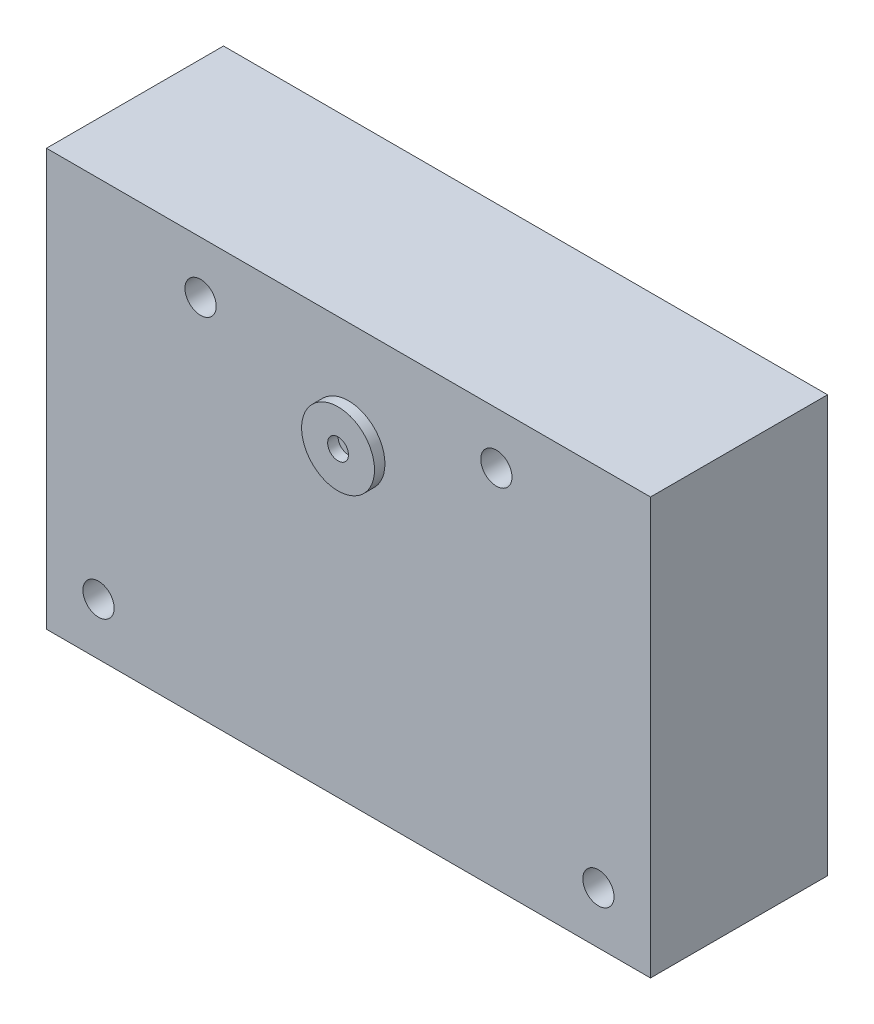
ISO-10303-21;
HEADER;
FILE_DESCRIPTION(('STEP AP214'),'2;1');
FILE_NAME('part.step','',(''),(''),'','','');
FILE_SCHEMA(('AUTOMOTIVE_DESIGN { 1 0 10303 214 1 1 1 1 }'));
ENDSEC;
DATA;
#1=APPLICATION_CONTEXT('core data for automotive mechanical design processes');
#2=APPLICATION_PROTOCOL_DEFINITION('international standard','automotive_design',2000,#1);
#3=PRODUCT_CONTEXT('',#1,'mechanical');
#4=PRODUCT('Part','Part','',(#3));
#5=PRODUCT_RELATED_PRODUCT_CATEGORY('part','',(#4));
#6=PRODUCT_DEFINITION_FORMATION('','',#4);
#7=PRODUCT_DEFINITION_CONTEXT('part definition',#1,'design');
#8=PRODUCT_DEFINITION('design','',#6,#7);
#9=PRODUCT_DEFINITION_SHAPE('','',#8);
#10=(LENGTH_UNIT() NAMED_UNIT(*) SI_UNIT(.MILLI.,.METRE.));
#11=(NAMED_UNIT(*) PLANE_ANGLE_UNIT() SI_UNIT($,.RADIAN.));
#12=(NAMED_UNIT(*) SI_UNIT($,.STERADIAN.) SOLID_ANGLE_UNIT());
#13=UNCERTAINTY_MEASURE_WITH_UNIT(LENGTH_MEASURE(1.E-05),#10,'distance_accuracy_value','');
#14=(GEOMETRIC_REPRESENTATION_CONTEXT(3) GLOBAL_UNCERTAINTY_ASSIGNED_CONTEXT((#13)) GLOBAL_UNIT_ASSIGNED_CONTEXT((#10,
#11,#12)) REPRESENTATION_CONTEXT('',''));
#15=CARTESIAN_POINT('',(0.,0.,0.));
#16=DIRECTION('',(0.,0.,1.));
#17=DIRECTION('',(1.,0.,0.));
#18=AXIS2_PLACEMENT_3D('',#15,#16,#17);
#19=CARTESIAN_POINT('',(29.,20.,17.));
#20=DIRECTION('',(-1.,0.,0.));
#21=DIRECTION('',(0.,-1.,0.));
#22=AXIS2_PLACEMENT_3D('',#19,#20,#21);
#23=PLANE('',#22);
#24=DIRECTION('',(0.,1.,0.));
#25=VECTOR('',#24,1.);
#26=CARTESIAN_POINT('',(29.,20.,0.));
#27=LINE('',#26,#25);
#28=CARTESIAN_POINT('',(29.,-20.,0.));
#29=VERTEX_POINT('',#28);
#30=CARTESIAN_POINT('',(29.,20.,0.));
#31=VERTEX_POINT('',#30);
#32=EDGE_CURVE('E173',#29,#31,#27,.T.);
#33=ORIENTED_EDGE('',*,*,#32,.T.);
#34=DIRECTION('',(0.,0.,-1.));
#35=VECTOR('',#34,1.);
#36=CARTESIAN_POINT('',(29.,20.,17.));
#37=LINE('',#36,#35);
#38=CARTESIAN_POINT('',(29.,20.,17.));
#39=VERTEX_POINT('',#38);
#40=EDGE_CURVE('E47',#39,#31,#37,.T.);
#41=ORIENTED_EDGE('',*,*,#40,.F.);
#42=DIRECTION('',(0.,1.,0.));
#43=VECTOR('',#42,1.);
#44=CARTESIAN_POINT('',(29.,20.,17.));
#45=LINE('',#44,#43);
#46=CARTESIAN_POINT('',(29.,-20.,17.));
#47=VERTEX_POINT('',#46);
#48=EDGE_CURVE('E201',#47,#39,#45,.T.);
#49=ORIENTED_EDGE('',*,*,#48,.F.);
#50=DIRECTION('',(0.,0.,-1.));
#51=VECTOR('',#50,1.);
#52=CARTESIAN_POINT('',(29.,-20.,17.));
#53=LINE('',#52,#51);
#54=EDGE_CURVE('E211',#47,#29,#53,.T.);
#55=ORIENTED_EDGE('',*,*,#54,.T.);
#56=EDGE_LOOP('',(#33,#41,#49,#55));
#57=FACE_BOUND('',#56,.T.);
#58=ADVANCED_FACE('F39',(#57),#23,.F.);
#59=CARTESIAN_POINT('',(-29.,20.,17.));
#60=DIRECTION('',(0.,-1.,0.));
#61=DIRECTION('',(0.,0.,-1.));
#62=AXIS2_PLACEMENT_3D('',#59,#60,#61);
#63=PLANE('',#62);
#64=DIRECTION('',(-1.,0.,0.));
#65=VECTOR('',#64,1.);
#66=CARTESIAN_POINT('',(-29.,20.,0.));
#67=LINE('',#66,#65);
#68=CARTESIAN_POINT('',(-29.,20.,0.));
#69=VERTEX_POINT('',#68);
#70=EDGE_CURVE('E215',#31,#69,#67,.T.);
#71=ORIENTED_EDGE('',*,*,#70,.T.);
#72=DIRECTION('',(0.,0.,-1.));
#73=VECTOR('',#72,1.);
#74=CARTESIAN_POINT('',(-29.,20.,17.));
#75=LINE('',#74,#73);
#76=CARTESIAN_POINT('',(-29.,20.,17.));
#77=VERTEX_POINT('',#76);
#78=EDGE_CURVE('E228',#77,#69,#75,.T.);
#79=ORIENTED_EDGE('',*,*,#78,.F.);
#80=DIRECTION('',(-1.,0.,0.));
#81=VECTOR('',#80,1.);
#82=CARTESIAN_POINT('',(-29.,20.,17.));
#83=LINE('',#82,#81);
#84=EDGE_CURVE('E92',#39,#77,#83,.T.);
#85=ORIENTED_EDGE('',*,*,#84,.F.);
#86=ORIENTED_EDGE('',*,*,#40,.T.);
#87=EDGE_LOOP('',(#71,#79,#85,#86));
#88=FACE_BOUND('',#87,.T.);
#89=ADVANCED_FACE('F233',(#88),#63,.F.);
#90=CARTESIAN_POINT('',(-29.,20.,17.));
#91=DIRECTION('',(1.,0.,0.));
#92=DIRECTION('',(0.,1.,0.));
#93=AXIS2_PLACEMENT_3D('',#90,#91,#92);
#94=PLANE('',#93);
#95=DIRECTION('',(0.,-1.,0.));
#96=VECTOR('',#95,1.);
#97=CARTESIAN_POINT('',(-29.,20.,0.));
#98=LINE('',#97,#96);
#99=CARTESIAN_POINT('',(-29.,-20.,0.));
#100=VERTEX_POINT('',#99);
#101=EDGE_CURVE('E218',#69,#100,#98,.T.);
#102=ORIENTED_EDGE('',*,*,#101,.T.);
#103=DIRECTION('',(0.,0.,-1.));
#104=VECTOR('',#103,1.);
#105=CARTESIAN_POINT('',(-29.,-20.,17.));
#106=LINE('',#105,#104);
#107=CARTESIAN_POINT('',(-29.,-20.,17.));
#108=VERTEX_POINT('',#107);
#109=EDGE_CURVE('E225',#108,#100,#106,.T.);
#110=ORIENTED_EDGE('',*,*,#109,.F.);
#111=DIRECTION('',(0.,-1.,0.));
#112=VECTOR('',#111,1.);
#113=CARTESIAN_POINT('',(-29.,20.,17.));
#114=LINE('',#113,#112);
#115=EDGE_CURVE('E206',#77,#108,#114,.T.);
#116=ORIENTED_EDGE('',*,*,#115,.F.);
#117=ORIENTED_EDGE('',*,*,#78,.T.);
#118=EDGE_LOOP('',(#102,#110,#116,#117));
#119=FACE_BOUND('',#118,.T.);
#120=ADVANCED_FACE('F242',(#119),#94,.F.);
#121=CARTESIAN_POINT('',(-29.,-20.,17.));
#122=DIRECTION('',(0.,1.,0.));
#123=DIRECTION('',(0.,0.,1.));
#124=AXIS2_PLACEMENT_3D('',#121,#122,#123);
#125=PLANE('',#124);
#126=DIRECTION('',(1.,0.,0.));
#127=VECTOR('',#126,1.);
#128=CARTESIAN_POINT('',(-29.,-20.,0.));
#129=LINE('',#128,#127);
#130=EDGE_CURVE('E84',#100,#29,#129,.T.);
#131=ORIENTED_EDGE('',*,*,#130,.T.);
#132=ORIENTED_EDGE('',*,*,#54,.F.);
#133=DIRECTION('',(1.,0.,0.));
#134=VECTOR('',#133,1.);
#135=CARTESIAN_POINT('',(-29.,-20.,17.));
#136=LINE('',#135,#134);
#137=EDGE_CURVE('E63',#108,#47,#136,.T.);
#138=ORIENTED_EDGE('',*,*,#137,.F.);
#139=ORIENTED_EDGE('',*,*,#109,.T.);
#140=EDGE_LOOP('',(#131,#132,#138,#139));
#141=FACE_BOUND('',#140,.T.);
#142=ADVANCED_FACE('F244',(#141),#125,.F.);
#143=CARTESIAN_POINT('',(0.,0.,17.));
#144=DIRECTION('',(0.,0.,1.));
#145=DIRECTION('',(1.,0.,0.));
#146=AXIS2_PLACEMENT_3D('',#143,#144,#145);
#147=PLANE('',#146);
#148=CARTESIAN_POINT('',(0.,10.,17.));
#149=DIRECTION('',(0.,0.,1.));
#150=DIRECTION('',(1.,0.,0.));
#151=AXIS2_PLACEMENT_3D('',#148,#149,#150);
#152=CIRCLE('',#151,3.5);
#153=CARTESIAN_POINT('',(3.5,10.,17.));
#154=VERTEX_POINT('',#153);
#155=EDGE_CURVE('E144',#154,#154,#152,.T.);
#156=ORIENTED_EDGE('',*,*,#155,.F.);
#157=EDGE_LOOP('',(#156));
#158=FACE_BOUND('',#157,.T.);
#159=CARTESIAN_POINT('',(-24.,-15.,17.));
#160=DIRECTION('',(0.,0.,1.));
#161=DIRECTION('',(1.,0.,0.));
#162=AXIS2_PLACEMENT_3D('',#159,#160,#161);
#163=CIRCLE('',#162,1.5);
#164=CARTESIAN_POINT('',(-22.5,-15.,17.));
#165=VERTEX_POINT('',#164);
#166=EDGE_CURVE('E174',#165,#165,#163,.T.);
#167=ORIENTED_EDGE('',*,*,#166,.F.);
#168=EDGE_LOOP('',(#167));
#169=FACE_BOUND('',#168,.T.);
#170=CARTESIAN_POINT('',(14.2,15.,17.));
#171=DIRECTION('',(0.,0.,1.));
#172=DIRECTION('',(1.,0.,0.));
#173=AXIS2_PLACEMENT_3D('',#170,#171,#172);
#174=CIRCLE('',#173,1.5);
#175=CARTESIAN_POINT('',(15.7,15.,17.));
#176=VERTEX_POINT('',#175);
#177=EDGE_CURVE('E163',#176,#176,#174,.T.);
#178=ORIENTED_EDGE('',*,*,#177,.F.);
#179=EDGE_LOOP('',(#178));
#180=FACE_BOUND('',#179,.T.);
#181=CARTESIAN_POINT('',(-14.2,15.,17.));
#182=DIRECTION('',(0.,0.,1.));
#183=DIRECTION('',(1.,0.,0.));
#184=AXIS2_PLACEMENT_3D('',#181,#182,#183);
#185=CIRCLE('',#184,1.5);
#186=CARTESIAN_POINT('',(-12.7,15.,17.));
#187=VERTEX_POINT('',#186);
#188=EDGE_CURVE('E183',#187,#187,#185,.T.);
#189=ORIENTED_EDGE('',*,*,#188,.F.);
#190=EDGE_LOOP('',(#189));
#191=FACE_BOUND('',#190,.T.);
#192=CARTESIAN_POINT('',(24.,-15.,17.));
#193=DIRECTION('',(0.,0.,1.));
#194=DIRECTION('',(1.,0.,0.));
#195=AXIS2_PLACEMENT_3D('',#192,#193,#194);
#196=CIRCLE('',#195,1.5);
#197=CARTESIAN_POINT('',(25.5,-15.,17.));
#198=VERTEX_POINT('',#197);
#199=EDGE_CURVE('E190',#198,#198,#196,.T.);
#200=ORIENTED_EDGE('',*,*,#199,.F.);
#201=EDGE_LOOP('',(#200));
#202=FACE_BOUND('',#201,.T.);
#203=ORIENTED_EDGE('',*,*,#48,.T.);
#204=ORIENTED_EDGE('',*,*,#84,.T.);
#205=ORIENTED_EDGE('',*,*,#115,.T.);
#206=ORIENTED_EDGE('',*,*,#137,.T.);
#207=EDGE_LOOP('',(#203,#204,#205,#206));
#208=FACE_BOUND('',#207,.T.);
#209=ADVANCED_FACE('F245',(#158,#169,#180,#191,#202,#208),#147,.T.);
#210=CARTESIAN_POINT('',(0.,0.,0.));
#211=DIRECTION('',(0.,0.,1.));
#212=DIRECTION('',(1.,0.,0.));
#213=AXIS2_PLACEMENT_3D('',#210,#211,#212);
#214=PLANE('',#213);
#215=DIRECTION('',(-1.,0.,0.));
#216=VECTOR('',#215,1.);
#217=CARTESIAN_POINT('',(26.,-17.,0.));
#218=LINE('',#217,#216);
#219=CARTESIAN_POINT('',(26.,-17.,0.));
#220=VERTEX_POINT('',#219);
#221=CARTESIAN_POINT('',(-17.,-17.,0.));
#222=VERTEX_POINT('',#221);
#223=EDGE_CURVE('E153',#220,#222,#218,.T.);
#224=ORIENTED_EDGE('',*,*,#223,.F.);
#225=DIRECTION('',(0.,-1.,0.));
#226=VECTOR('',#225,1.);
#227=CARTESIAN_POINT('',(26.,17.,0.));
#228=LINE('',#227,#226);
#229=CARTESIAN_POINT('',(26.,17.,0.));
#230=VERTEX_POINT('',#229);
#231=EDGE_CURVE('E54',#230,#220,#228,.T.);
#232=ORIENTED_EDGE('',*,*,#231,.F.);
#233=DIRECTION('',(1.,0.,0.));
#234=VECTOR('',#233,1.);
#235=CARTESIAN_POINT('',(26.,17.,0.));
#236=LINE('',#235,#234);
#237=CARTESIAN_POINT('',(-17.,17.,0.));
#238=VERTEX_POINT('',#237);
#239=EDGE_CURVE('E137',#238,#230,#236,.T.);
#240=ORIENTED_EDGE('',*,*,#239,.F.);
#241=DIRECTION('',(0.,1.,0.));
#242=VECTOR('',#241,1.);
#243=CARTESIAN_POINT('',(-17.,17.,0.));
#244=LINE('',#243,#242);
#245=EDGE_CURVE('E141',#222,#238,#244,.T.);
#246=ORIENTED_EDGE('',*,*,#245,.F.);
#247=EDGE_LOOP('',(#224,#232,#240,#246));
#248=FACE_BOUND('',#247,.T.);
#249=ORIENTED_EDGE('',*,*,#32,.F.);
#250=ORIENTED_EDGE('',*,*,#130,.F.);
#251=ORIENTED_EDGE('',*,*,#101,.F.);
#252=ORIENTED_EDGE('',*,*,#70,.F.);
#253=EDGE_LOOP('',(#249,#250,#251,#252));
#254=FACE_BOUND('',#253,.T.);
#255=ADVANCED_FACE('F238',(#248,#254),#214,.F.);
#256=CARTESIAN_POINT('',(24.,-15.,12.));
#257=DIRECTION('',(0.,0.,1.));
#258=DIRECTION('',(1.,0.,0.));
#259=AXIS2_PLACEMENT_3D('',#256,#257,#258);
#260=CYLINDRICAL_SURFACE('',#259,1.5);
#261=CARTESIAN_POINT('',(24.,-15.,12.));
#262=DIRECTION('',(0.,0.,1.));
#263=DIRECTION('',(1.,0.,0.));
#264=AXIS2_PLACEMENT_3D('',#261,#262,#263);
#265=CIRCLE('',#264,1.5);
#266=CARTESIAN_POINT('',(25.5,-15.,12.));
#267=VERTEX_POINT('',#266);
#268=EDGE_CURVE('E178',#267,#267,#265,.T.);
#269=ORIENTED_EDGE('',*,*,#268,.F.);
#270=EDGE_LOOP('',(#269));
#271=FACE_BOUND('',#270,.T.);
#272=ORIENTED_EDGE('',*,*,#199,.T.);
#273=EDGE_LOOP('',(#272));
#274=FACE_BOUND('',#273,.T.);
#275=ADVANCED_FACE('F255',(#271,#274),#260,.F.);
#276=CARTESIAN_POINT('',(24.,-15.,12.));
#277=DIRECTION('',(0.,0.,1.));
#278=DIRECTION('',(1.,0.,0.));
#279=AXIS2_PLACEMENT_3D('',#276,#277,#278);
#280=PLANE('',#279);
#281=ORIENTED_EDGE('',*,*,#268,.T.);
#282=EDGE_LOOP('',(#281));
#283=FACE_BOUND('',#282,.T.);
#284=ADVANCED_FACE('F296',(#283),#280,.T.);
#285=CARTESIAN_POINT('',(-14.2,15.,12.));
#286=DIRECTION('',(0.,0.,1.));
#287=DIRECTION('',(1.,0.,0.));
#288=AXIS2_PLACEMENT_3D('',#285,#286,#287);
#289=CYLINDRICAL_SURFACE('',#288,1.5);
#290=CARTESIAN_POINT('',(-14.2,15.,12.));
#291=DIRECTION('',(0.,0.,1.));
#292=DIRECTION('',(1.,0.,0.));
#293=AXIS2_PLACEMENT_3D('',#290,#291,#292);
#294=CIRCLE('',#293,1.5);
#295=CARTESIAN_POINT('',(-12.7,15.,12.));
#296=VERTEX_POINT('',#295);
#297=EDGE_CURVE('E194',#296,#296,#294,.T.);
#298=ORIENTED_EDGE('',*,*,#297,.F.);
#299=EDGE_LOOP('',(#298));
#300=FACE_BOUND('',#299,.T.);
#301=ORIENTED_EDGE('',*,*,#188,.T.);
#302=EDGE_LOOP('',(#301));
#303=FACE_BOUND('',#302,.T.);
#304=ADVANCED_FACE('F304',(#300,#303),#289,.F.);
#305=CARTESIAN_POINT('',(-14.2,15.,12.));
#306=DIRECTION('',(0.,0.,1.));
#307=DIRECTION('',(1.,0.,0.));
#308=AXIS2_PLACEMENT_3D('',#305,#306,#307);
#309=PLANE('',#308);
#310=ORIENTED_EDGE('',*,*,#297,.T.);
#311=EDGE_LOOP('',(#310));
#312=FACE_BOUND('',#311,.T.);
#313=ADVANCED_FACE('F312',(#312),#309,.T.);
#314=CARTESIAN_POINT('',(14.2,15.,12.));
#315=DIRECTION('',(0.,0.,1.));
#316=DIRECTION('',(1.,0.,0.));
#317=AXIS2_PLACEMENT_3D('',#314,#315,#316);
#318=CYLINDRICAL_SURFACE('',#317,1.5);
#319=CARTESIAN_POINT('',(14.2,15.,12.));
#320=DIRECTION('',(0.,0.,1.));
#321=DIRECTION('',(1.,0.,0.));
#322=AXIS2_PLACEMENT_3D('',#319,#320,#321);
#323=CIRCLE('',#322,1.5);
#324=CARTESIAN_POINT('',(15.7,15.,12.));
#325=VERTEX_POINT('',#324);
#326=EDGE_CURVE('E179',#325,#325,#323,.T.);
#327=ORIENTED_EDGE('',*,*,#326,.F.);
#328=EDGE_LOOP('',(#327));
#329=FACE_BOUND('',#328,.T.);
#330=ORIENTED_EDGE('',*,*,#177,.T.);
#331=EDGE_LOOP('',(#330));
#332=FACE_BOUND('',#331,.T.);
#333=ADVANCED_FACE('F319',(#329,#332),#318,.F.);
#334=CARTESIAN_POINT('',(14.2,15.,12.));
#335=DIRECTION('',(0.,0.,1.));
#336=DIRECTION('',(1.,0.,0.));
#337=AXIS2_PLACEMENT_3D('',#334,#335,#336);
#338=PLANE('',#337);
#339=ORIENTED_EDGE('',*,*,#326,.T.);
#340=EDGE_LOOP('',(#339));
#341=FACE_BOUND('',#340,.T.);
#342=ADVANCED_FACE('F327',(#341),#338,.T.);
#343=CARTESIAN_POINT('',(-24.,-15.,12.));
#344=DIRECTION('',(0.,0.,1.));
#345=DIRECTION('',(1.,0.,0.));
#346=AXIS2_PLACEMENT_3D('',#343,#344,#345);
#347=CYLINDRICAL_SURFACE('',#346,1.5);
#348=CARTESIAN_POINT('',(-24.,-15.,12.));
#349=DIRECTION('',(0.,0.,1.));
#350=DIRECTION('',(1.,0.,0.));
#351=AXIS2_PLACEMENT_3D('',#348,#349,#350);
#352=CIRCLE('',#351,1.5);
#353=CARTESIAN_POINT('',(-22.5,-15.,12.));
#354=VERTEX_POINT('',#353);
#355=EDGE_CURVE('E169',#354,#354,#352,.T.);
#356=ORIENTED_EDGE('',*,*,#355,.F.);
#357=EDGE_LOOP('',(#356));
#358=FACE_BOUND('',#357,.T.);
#359=ORIENTED_EDGE('',*,*,#166,.T.);
#360=EDGE_LOOP('',(#359));
#361=FACE_BOUND('',#360,.T.);
#362=ADVANCED_FACE('F335',(#358,#361),#347,.F.);
#363=CARTESIAN_POINT('',(-24.,-15.,12.));
#364=DIRECTION('',(0.,0.,1.));
#365=DIRECTION('',(1.,0.,0.));
#366=AXIS2_PLACEMENT_3D('',#363,#364,#365);
#367=PLANE('',#366);
#368=ORIENTED_EDGE('',*,*,#355,.T.);
#369=EDGE_LOOP('',(#368));
#370=FACE_BOUND('',#369,.T.);
#371=ADVANCED_FACE('F343',(#370),#367,.T.);
#372=CARTESIAN_POINT('',(26.,17.,0.5));
#373=DIRECTION('',(1.,0.,0.));
#374=DIRECTION('',(0.,1.,0.));
#375=AXIS2_PLACEMENT_3D('',#372,#373,#374);
#376=PLANE('',#375);
#377=ORIENTED_EDGE('',*,*,#231,.T.);
#378=DIRECTION('',(0.,0.,-1.));
#379=VECTOR('',#378,1.);
#380=CARTESIAN_POINT('',(26.,-17.,0.5));
#381=LINE('',#380,#379);
#382=CARTESIAN_POINT('',(26.,-17.,0.5));
#383=VERTEX_POINT('',#382);
#384=EDGE_CURVE('E112',#383,#220,#381,.T.);
#385=ORIENTED_EDGE('',*,*,#384,.F.);
#386=DIRECTION('',(0.,-1.,0.));
#387=VECTOR('',#386,1.);
#388=CARTESIAN_POINT('',(26.,17.,0.5));
#389=LINE('',#388,#387);
#390=CARTESIAN_POINT('',(26.,17.,0.5));
#391=VERTEX_POINT('',#390);
#392=EDGE_CURVE('E116',#391,#383,#389,.T.);
#393=ORIENTED_EDGE('',*,*,#392,.F.);
#394=DIRECTION('',(0.,0.,-1.));
#395=VECTOR('',#394,1.);
#396=CARTESIAN_POINT('',(26.,17.,0.5));
#397=LINE('',#396,#395);
#398=EDGE_CURVE('E160',#391,#230,#397,.T.);
#399=ORIENTED_EDGE('',*,*,#398,.T.);
#400=EDGE_LOOP('',(#377,#385,#393,#399));
#401=FACE_BOUND('',#400,.T.);
#402=ADVANCED_FACE('F114',(#401),#376,.F.);
#403=CARTESIAN_POINT('',(26.,17.,0.5));
#404=DIRECTION('',(0.,1.,0.));
#405=DIRECTION('',(0.,0.,1.));
#406=AXIS2_PLACEMENT_3D('',#403,#404,#405);
#407=PLANE('',#406);
#408=ORIENTED_EDGE('',*,*,#239,.T.);
#409=ORIENTED_EDGE('',*,*,#398,.F.);
#410=DIRECTION('',(1.,0.,0.));
#411=VECTOR('',#410,1.);
#412=CARTESIAN_POINT('',(26.,17.,0.5));
#413=LINE('',#412,#411);
#414=CARTESIAN_POINT('',(-17.,17.,0.5));
#415=VERTEX_POINT('',#414);
#416=EDGE_CURVE('E123',#415,#391,#413,.T.);
#417=ORIENTED_EDGE('',*,*,#416,.F.);
#418=DIRECTION('',(0.,0.,-1.));
#419=VECTOR('',#418,1.);
#420=CARTESIAN_POINT('',(-17.,17.,0.5));
#421=LINE('',#420,#419);
#422=EDGE_CURVE('E164',#415,#238,#421,.T.);
#423=ORIENTED_EDGE('',*,*,#422,.T.);
#424=EDGE_LOOP('',(#408,#409,#417,#423));
#425=FACE_BOUND('',#424,.T.);
#426=ADVANCED_FACE('F356',(#425),#407,.F.);
#427=CARTESIAN_POINT('',(-17.,17.,0.5));
#428=DIRECTION('',(-1.,0.,0.));
#429=DIRECTION('',(0.,-1.,0.));
#430=AXIS2_PLACEMENT_3D('',#427,#428,#429);
#431=PLANE('',#430);
#432=ORIENTED_EDGE('',*,*,#245,.T.);
#433=ORIENTED_EDGE('',*,*,#422,.F.);
#434=DIRECTION('',(0.,1.,0.));
#435=VECTOR('',#434,1.);
#436=CARTESIAN_POINT('',(-17.,17.,0.5));
#437=LINE('',#436,#435);
#438=CARTESIAN_POINT('',(-17.,-17.,0.5));
#439=VERTEX_POINT('',#438);
#440=EDGE_CURVE('E132',#439,#415,#437,.T.);
#441=ORIENTED_EDGE('',*,*,#440,.F.);
#442=DIRECTION('',(0.,0.,-1.));
#443=VECTOR('',#442,1.);
#444=CARTESIAN_POINT('',(-17.,-17.,0.5));
#445=LINE('',#444,#443);
#446=EDGE_CURVE('E122',#439,#222,#445,.T.);
#447=ORIENTED_EDGE('',*,*,#446,.T.);
#448=EDGE_LOOP('',(#432,#433,#441,#447));
#449=FACE_BOUND('',#448,.T.);
#450=ADVANCED_FACE('F363',(#449),#431,.F.);
#451=CARTESIAN_POINT('',(26.,-17.,0.5));
#452=DIRECTION('',(0.,-1.,0.));
#453=DIRECTION('',(0.,0.,-1.));
#454=AXIS2_PLACEMENT_3D('',#451,#452,#453);
#455=PLANE('',#454);
#456=ORIENTED_EDGE('',*,*,#223,.T.);
#457=ORIENTED_EDGE('',*,*,#446,.F.);
#458=DIRECTION('',(-1.,0.,0.));
#459=VECTOR('',#458,1.);
#460=CARTESIAN_POINT('',(26.,-17.,0.5));
#461=LINE('',#460,#459);
#462=EDGE_CURVE('E126',#383,#439,#461,.T.);
#463=ORIENTED_EDGE('',*,*,#462,.F.);
#464=ORIENTED_EDGE('',*,*,#384,.T.);
#465=EDGE_LOOP('',(#456,#457,#463,#464));
#466=FACE_BOUND('',#465,.T.);
#467=ADVANCED_FACE('F127',(#466),#455,.F.);
#468=CARTESIAN_POINT('',(0.,0.,0.5));
#469=DIRECTION('',(0.,0.,-1.));
#470=DIRECTION('',(-1.,0.,0.));
#471=AXIS2_PLACEMENT_3D('',#468,#469,#470);
#472=PLANE('',#471);
#473=ORIENTED_EDGE('',*,*,#392,.T.);
#474=ORIENTED_EDGE('',*,*,#462,.T.);
#475=ORIENTED_EDGE('',*,*,#440,.T.);
#476=ORIENTED_EDGE('',*,*,#416,.T.);
#477=EDGE_LOOP('',(#473,#474,#475,#476));
#478=FACE_BOUND('',#477,.T.);
#479=ADVANCED_FACE('F134',(#478),#472,.T.);
#480=CARTESIAN_POINT('',(0.,10.,18.));
#481=DIRECTION('',(0.,0.,1.));
#482=DIRECTION('',(1.,0.,0.));
#483=AXIS2_PLACEMENT_3D('',#480,#481,#482);
#484=PLANE('',#483);
#485=CARTESIAN_POINT('',(0.,10.,18.));
#486=DIRECTION('',(0.,0.,1.));
#487=DIRECTION('',(1.,0.,0.));
#488=AXIS2_PLACEMENT_3D('',#485,#486,#487);
#489=CIRCLE('',#488,3.5);
#490=CARTESIAN_POINT('',(3.5,10.,18.));
#491=VERTEX_POINT('',#490);
#492=EDGE_CURVE('E154',#491,#491,#489,.T.);
#493=ORIENTED_EDGE('',*,*,#492,.T.);
#494=EDGE_LOOP('',(#493));
#495=FACE_BOUND('',#494,.T.);
#496=CARTESIAN_POINT('',(0.,10.,18.));
#497=DIRECTION('',(0.,0.,1.));
#498=DIRECTION('',(1.,0.,0.));
#499=AXIS2_PLACEMENT_3D('',#496,#497,#498);
#500=CIRCLE('',#499,1.);
#501=CARTESIAN_POINT('',(1.,10.,18.));
#502=VERTEX_POINT('',#501);
#503=EDGE_CURVE('E422',#502,#502,#500,.T.);
#504=ORIENTED_EDGE('',*,*,#503,.F.);
#505=EDGE_LOOP('',(#504));
#506=FACE_BOUND('',#505,.T.);
#507=ADVANCED_FACE('F383',(#495,#506),#484,.T.);
#508=CARTESIAN_POINT('',(0.,10.,18.));
#509=DIRECTION('',(0.,0.,-1.));
#510=DIRECTION('',(-1.,0.,0.));
#511=AXIS2_PLACEMENT_3D('',#508,#509,#510);
#512=CYLINDRICAL_SURFACE('',#511,3.5);
#513=ORIENTED_EDGE('',*,*,#492,.F.);
#514=EDGE_LOOP('',(#513));
#515=FACE_BOUND('',#514,.T.);
#516=ORIENTED_EDGE('',*,*,#155,.T.);
#517=EDGE_LOOP('',(#516));
#518=FACE_BOUND('',#517,.T.);
#519=ADVANCED_FACE('F395',(#515,#518),#512,.T.);
#520=CARTESIAN_POINT('',(0.,10.,18.));
#521=DIRECTION('',(0.,0.,-1.));
#522=DIRECTION('',(-1.,0.,0.));
#523=AXIS2_PLACEMENT_3D('',#520,#521,#522);
#524=CYLINDRICAL_SURFACE('',#523,1.);
#525=ORIENTED_EDGE('',*,*,#503,.T.);
#526=EDGE_LOOP('',(#525));
#527=FACE_BOUND('',#526,.T.);
#528=CARTESIAN_POINT('',(0.,10.,17.));
#529=DIRECTION('',(0.,0.,1.));
#530=DIRECTION('',(1.,0.,0.));
#531=AXIS2_PLACEMENT_3D('',#528,#529,#530);
#532=CIRCLE('',#531,1.);
#533=CARTESIAN_POINT('',(1.,10.,17.));
#534=VERTEX_POINT('',#533);
#535=EDGE_CURVE('E11',#534,#534,#532,.F.);
#536=ORIENTED_EDGE('',*,*,#535,.T.);
#537=EDGE_LOOP('',(#536));
#538=FACE_BOUND('',#537,.T.);
#539=ADVANCED_FACE('F264',(#527,#538),#524,.F.);
#540=ORIENTED_EDGE('',*,*,#535,.F.);
#541=EDGE_LOOP('',(#540));
#542=FACE_BOUND('',#541,.T.);
#543=ADVANCED_FACE('F249',(#542),#147,.T.);
#544=CLOSED_SHELL('',(#58,#89,#120,#142,#209,#255,#275,#284,#304,#313,#333,#342,#362,#371,#402,
#426,#450,#467,#479,#507,#519,#539,#543));
#545=MANIFOLD_SOLID_BREP('B2',#544);
#546=ADVANCED_BREP_SHAPE_REPRESENTATION('',(#18,#545),#14);
#547=SHAPE_DEFINITION_REPRESENTATION(#9,#546);
ENDSEC;
END-ISO-10303-21;
